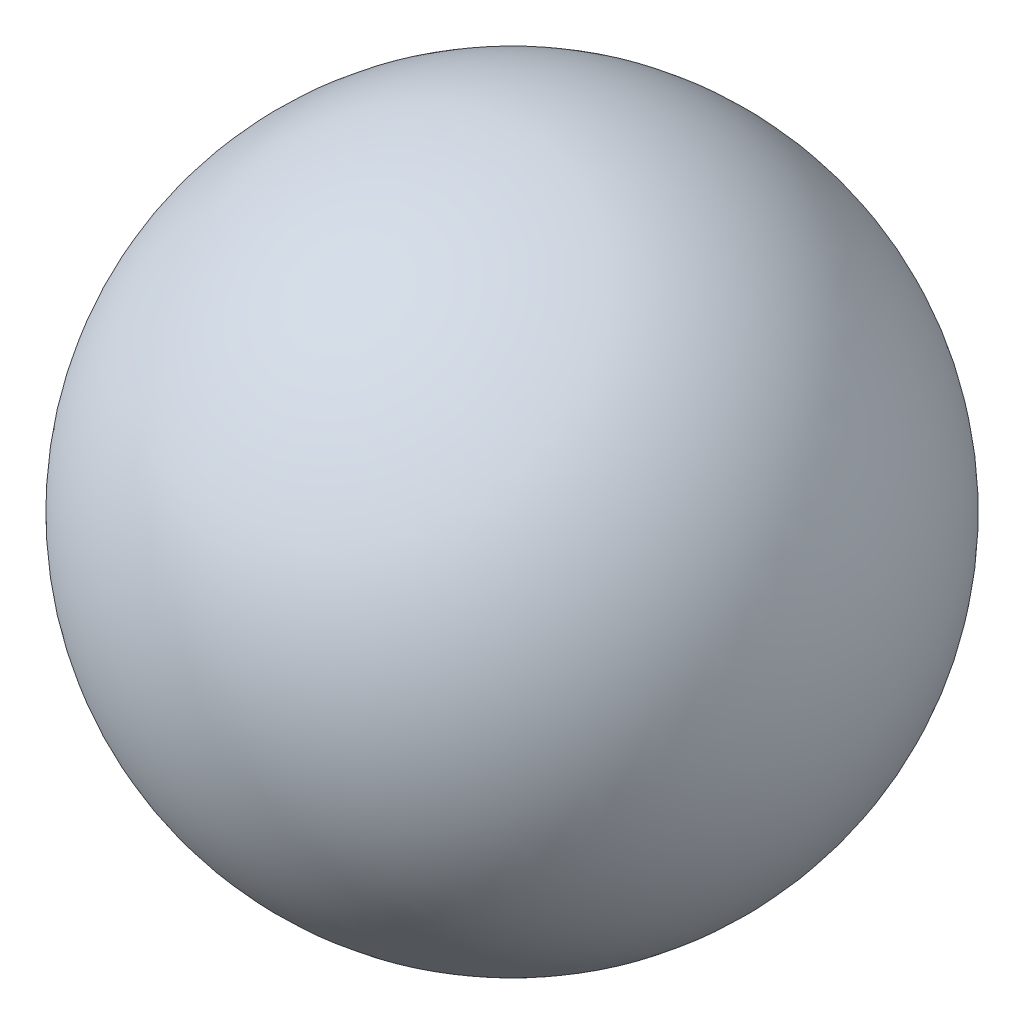
ISO-10303-21;
HEADER;
FILE_DESCRIPTION(('STEP AP214'),'2;1');
FILE_NAME('part.step','',(''),(''),'','','');
FILE_SCHEMA(('AUTOMOTIVE_DESIGN { 1 0 10303 214 1 1 1 1 }'));
ENDSEC;
DATA;
#1=APPLICATION_CONTEXT('core data for automotive mechanical design processes');
#2=APPLICATION_PROTOCOL_DEFINITION('international standard','automotive_design',2000,#1);
#3=PRODUCT_CONTEXT('',#1,'mechanical');
#4=PRODUCT('Part','Part','',(#3));
#5=PRODUCT_RELATED_PRODUCT_CATEGORY('part','',(#4));
#6=PRODUCT_DEFINITION_FORMATION('','',#4);
#7=PRODUCT_DEFINITION_CONTEXT('part definition',#1,'design');
#8=PRODUCT_DEFINITION('design','',#6,#7);
#9=PRODUCT_DEFINITION_SHAPE('','',#8);
#10=(LENGTH_UNIT() NAMED_UNIT(*) SI_UNIT(.MILLI.,.METRE.));
#11=(NAMED_UNIT(*) PLANE_ANGLE_UNIT() SI_UNIT($,.RADIAN.));
#12=(NAMED_UNIT(*) SI_UNIT($,.STERADIAN.) SOLID_ANGLE_UNIT());
#13=UNCERTAINTY_MEASURE_WITH_UNIT(LENGTH_MEASURE(1.E-05),#10,'distance_accuracy_value','');
#14=(GEOMETRIC_REPRESENTATION_CONTEXT(3) GLOBAL_UNCERTAINTY_ASSIGNED_CONTEXT((#13)) GLOBAL_UNIT_ASSIGNED_CONTEXT((#10,
#11,#12)) REPRESENTATION_CONTEXT('',''));
#15=CARTESIAN_POINT('',(0.,0.,0.));
#16=DIRECTION('',(0.,0.,1.));
#17=DIRECTION('',(1.,0.,0.));
#18=AXIS2_PLACEMENT_3D('',#15,#16,#17);
#19=CARTESIAN_POINT('',(0.,0.,0.));
#20=DIRECTION('',(0.,1.,0.));
#21=DIRECTION('',(1.,0.,0.));
#22=AXIS2_PLACEMENT_3D('',#19,#20,#21);
#23=SPHERICAL_SURFACE('',#22,21.5);
#24=CARTESIAN_POINT('',(0.,21.5,0.));
#25=VERTEX_POINT('',#24);
#26=VERTEX_LOOP('',#25);
#27=FACE_BOUND('',#26,.T.);
#28=ADVANCED_FACE('F30',(#27),#23,.T.);
#29=CLOSED_SHELL('',(#28));
#30=MANIFOLD_SOLID_BREP('B2',#29);
#31=ADVANCED_BREP_SHAPE_REPRESENTATION('',(#18,#30),#14);
#32=SHAPE_DEFINITION_REPRESENTATION(#9,#31);
ENDSEC;
END-ISO-10303-21;
